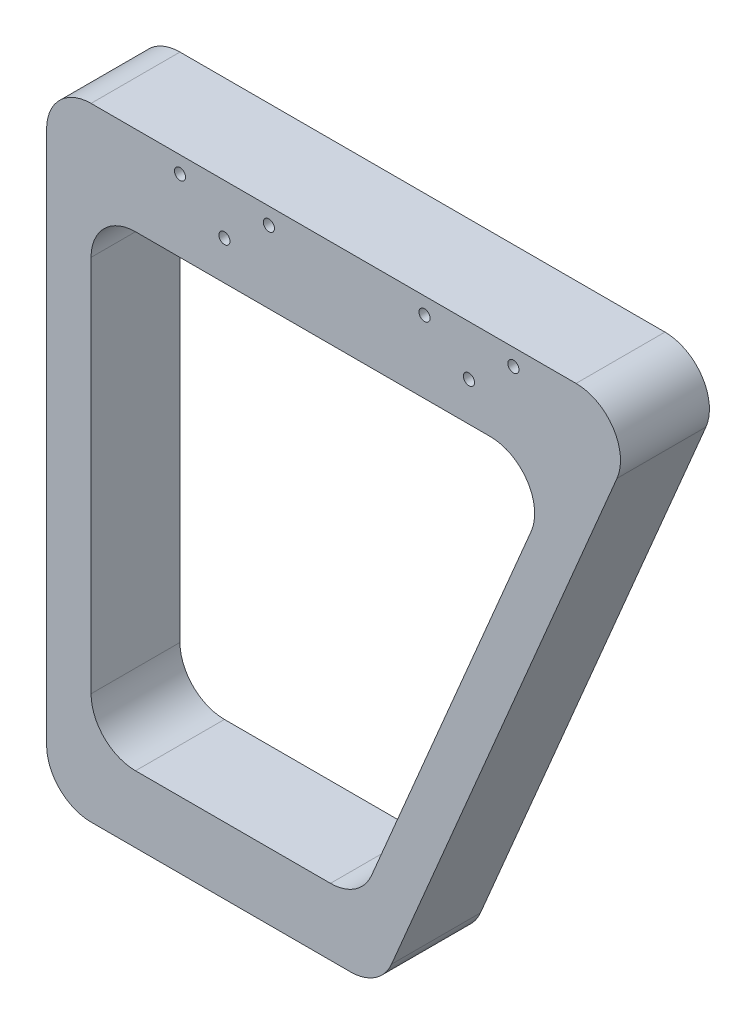
ISO-10303-21;
HEADER;
FILE_DESCRIPTION(('STEP AP214'),'2;1');
FILE_NAME('part.step','',(''),(''),'','','');
FILE_SCHEMA(('AUTOMOTIVE_DESIGN { 1 0 10303 214 1 1 1 1 }'));
ENDSEC;
DATA;
#1=APPLICATION_CONTEXT('core data for automotive mechanical design processes');
#2=APPLICATION_PROTOCOL_DEFINITION('international standard','automotive_design',2000,#1);
#3=PRODUCT_CONTEXT('',#1,'mechanical');
#4=PRODUCT('Part','Part','',(#3));
#5=PRODUCT_RELATED_PRODUCT_CATEGORY('part','',(#4));
#6=PRODUCT_DEFINITION_FORMATION('','',#4);
#7=PRODUCT_DEFINITION_CONTEXT('part definition',#1,'design');
#8=PRODUCT_DEFINITION('design','',#6,#7);
#9=PRODUCT_DEFINITION_SHAPE('','',#8);
#10=(LENGTH_UNIT() NAMED_UNIT(*) SI_UNIT(.MILLI.,.METRE.));
#11=(NAMED_UNIT(*) PLANE_ANGLE_UNIT() SI_UNIT($,.RADIAN.));
#12=(NAMED_UNIT(*) SI_UNIT($,.STERADIAN.) SOLID_ANGLE_UNIT());
#13=UNCERTAINTY_MEASURE_WITH_UNIT(LENGTH_MEASURE(1.E-05),#10,'distance_accuracy_value','');
#14=(GEOMETRIC_REPRESENTATION_CONTEXT(3) GLOBAL_UNCERTAINTY_ASSIGNED_CONTEXT((#13)) GLOBAL_UNIT_ASSIGNED_CONTEXT((#10,
#11,#12)) REPRESENTATION_CONTEXT('',''));
#15=CARTESIAN_POINT('',(0.,0.,0.));
#16=DIRECTION('',(0.,0.,1.));
#17=DIRECTION('',(1.,0.,0.));
#18=AXIS2_PLACEMENT_3D('',#15,#16,#17);
#19=CARTESIAN_POINT('',(-106.206306961118,44.8880670486545,40.));
#20=DIRECTION('',(0.921108392910916,-0.389306214321157,0.));
#21=DIRECTION('',(0.389306214321157,0.921108392910916,0.));
#22=AXIS2_PLACEMENT_3D('',#19,#20,#21);
#23=PLANE('',#22);
#24=DIRECTION('',(-0.389306214321157,-0.921108392910916,0.));
#25=VECTOR('',#24,1.);
#26=CARTESIAN_POINT('',(-106.206306961118,44.8880670486545,0.));
#27=LINE('',#26,#25);
#28=CARTESIAN_POINT('',(-92.6790897319771,76.893806654475,0.));
#29=VERTEX_POINT('',#28);
#30=CARTESIAN_POINT('',(-164.52954397162,-93.1061933455251,0.));
#31=VERTEX_POINT('',#30);
#32=EDGE_CURVE('E286',#29,#31,#27,.T.);
#33=ORIENTED_EDGE('',*,*,#32,.T.);
#34=DIRECTION('',(0.,0.,-1.));
#35=VECTOR('',#34,1.);
#36=CARTESIAN_POINT('',(-164.52954397162,-93.1061933455251,40.));
#37=LINE('',#36,#35);
#38=CARTESIAN_POINT('',(-164.52954397162,-93.1061933455251,40.));
#39=VERTEX_POINT('',#38);
#40=EDGE_CURVE('E263',#31,#39,#37,.F.);
#41=ORIENTED_EDGE('',*,*,#40,.T.);
#42=DIRECTION('',(-0.389306214321157,-0.921108392910916,0.));
#43=VECTOR('',#42,1.);
#44=CARTESIAN_POINT('',(-106.206306961118,44.8880670486545,40.));
#45=LINE('',#44,#43);
#46=CARTESIAN_POINT('',(-92.6790897319771,76.893806654475,40.));
#47=VERTEX_POINT('',#46);
#48=EDGE_CURVE('E298',#47,#39,#45,.T.);
#49=ORIENTED_EDGE('',*,*,#48,.F.);
#50=DIRECTION('',(0.,0.,-1.));
#51=VECTOR('',#50,1.);
#52=CARTESIAN_POINT('',(-92.6790897319771,76.893806654475,0.));
#53=LINE('',#52,#51);
#54=EDGE_CURVE('E259',#47,#29,#53,.T.);
#55=ORIENTED_EDGE('',*,*,#54,.T.);
#56=EDGE_LOOP('',(#33,#41,#49,#55));
#57=FACE_BOUND('',#56,.T.);
#58=ADVANCED_FACE('F45',(#57),#23,.F.);
#59=CARTESIAN_POINT('',(0.,-105.320069059102,40.));
#60=DIRECTION('',(0.,-1.,0.));
#61=DIRECTION('',(1.,0.,0.));
#62=AXIS2_PLACEMENT_3D('',#59,#60,#61);
#63=PLANE('',#62);
#64=DIRECTION('',(-1.,0.,0.));
#65=VECTOR('',#64,1.);
#66=CARTESIAN_POINT('',(0.,-105.320069059102,0.));
#67=LINE('',#66,#65);
#68=CARTESIAN_POINT('',(-182.951711829838,-105.320069059102,0.));
#69=VERTEX_POINT('',#68);
#70=CARTESIAN_POINT('',(-270.658255986875,-105.320069059102,0.));
#71=VERTEX_POINT('',#70);
#72=EDGE_CURVE('E329',#69,#71,#67,.T.);
#73=ORIENTED_EDGE('',*,*,#72,.T.);
#74=DIRECTION('',(0.,0.,-1.));
#75=VECTOR('',#74,1.);
#76=CARTESIAN_POINT('',(-270.658255986875,-105.320069059102,40.));
#77=LINE('',#76,#75);
#78=CARTESIAN_POINT('',(-270.658255986875,-105.320069059102,40.));
#79=VERTEX_POINT('',#78);
#80=EDGE_CURVE('E256',#71,#79,#77,.F.);
#81=ORIENTED_EDGE('',*,*,#80,.T.);
#82=DIRECTION('',(-1.,0.,0.));
#83=VECTOR('',#82,1.);
#84=CARTESIAN_POINT('',(0.,-105.320069059102,40.));
#85=LINE('',#84,#83);
#86=CARTESIAN_POINT('',(-182.951711829838,-105.320069059102,40.));
#87=VERTEX_POINT('',#86);
#88=EDGE_CURVE('E303',#87,#79,#85,.T.);
#89=ORIENTED_EDGE('',*,*,#88,.F.);
#90=DIRECTION('',(0.,0.,-1.));
#91=VECTOR('',#90,1.);
#92=CARTESIAN_POINT('',(-182.951711829838,-105.320069059102,0.));
#93=LINE('',#92,#91);
#94=EDGE_CURVE('E252',#87,#69,#93,.T.);
#95=ORIENTED_EDGE('',*,*,#94,.T.);
#96=EDGE_LOOP('',(#73,#81,#89,#95));
#97=FACE_BOUND('',#96,.T.);
#98=ADVANCED_FACE('F357',(#97),#63,.F.);
#99=CARTESIAN_POINT('',(-290.658255986875,0.,40.));
#100=DIRECTION('',(-1.,0.,0.));
#101=DIRECTION('',(0.,0.,1.));
#102=AXIS2_PLACEMENT_3D('',#99,#100,#101);
#103=PLANE('',#102);
#104=DIRECTION('',(0.,1.,0.));
#105=VECTOR('',#104,1.);
#106=CARTESIAN_POINT('',(-290.658255986875,0.,0.));
#107=LINE('',#106,#105);
#108=CARTESIAN_POINT('',(-290.658255986875,-85.320069059102,0.));
#109=VERTEX_POINT('',#108);
#110=CARTESIAN_POINT('',(-290.658255986875,84.6799309408981,0.));
#111=VERTEX_POINT('',#110);
#112=EDGE_CURVE('E293',#109,#111,#107,.T.);
#113=ORIENTED_EDGE('',*,*,#112,.T.);
#114=DIRECTION('',(0.,0.,-1.));
#115=VECTOR('',#114,1.);
#116=CARTESIAN_POINT('',(-290.658255986875,84.6799309408981,40.));
#117=LINE('',#116,#115);
#118=CARTESIAN_POINT('',(-290.658255986875,84.6799309408981,40.));
#119=VERTEX_POINT('',#118);
#120=EDGE_CURVE('E249',#111,#119,#117,.F.);
#121=ORIENTED_EDGE('',*,*,#120,.T.);
#122=DIRECTION('',(0.,1.,0.));
#123=VECTOR('',#122,1.);
#124=CARTESIAN_POINT('',(-290.658255986875,0.,40.));
#125=LINE('',#124,#123);
#126=CARTESIAN_POINT('',(-290.658255986875,-85.320069059102,40.));
#127=VERTEX_POINT('',#126);
#128=EDGE_CURVE('E196',#127,#119,#125,.T.);
#129=ORIENTED_EDGE('',*,*,#128,.F.);
#130=DIRECTION('',(0.,0.,-1.));
#131=VECTOR('',#130,1.);
#132=CARTESIAN_POINT('',(-290.658255986875,-85.320069059102,0.));
#133=LINE('',#132,#131);
#134=EDGE_CURVE('E245',#127,#109,#133,.T.);
#135=ORIENTED_EDGE('',*,*,#134,.T.);
#136=EDGE_LOOP('',(#113,#121,#129,#135));
#137=FACE_BOUND('',#136,.T.);
#138=ADVANCED_FACE('F337',(#137),#103,.F.);
#139=CARTESIAN_POINT('',(0.,144.679930940898,40.));
#140=DIRECTION('',(0.,1.,0.));
#141=DIRECTION('',(0.,0.,1.));
#142=AXIS2_PLACEMENT_3D('',#139,#140,#141);
#143=PLANE('',#142);
#144=DIRECTION('',(1.,0.,0.));
#145=VECTOR('',#144,1.);
#146=CARTESIAN_POINT('',(0.,144.679930940898,0.));
#147=LINE('',#146,#145);
#148=CARTESIAN_POINT('',(-290.658255986875,144.679930940898,0.));
#149=VERTEX_POINT('',#148);
#150=CARTESIAN_POINT('',(-72.4822971653211,144.679930940898,0.));
#151=VERTEX_POINT('',#150);
#152=EDGE_CURVE('E184',#149,#151,#147,.T.);
#153=ORIENTED_EDGE('',*,*,#152,.F.);
#154=DIRECTION('',(0.,0.,-1.));
#155=VECTOR('',#154,1.);
#156=CARTESIAN_POINT('',(-290.658255986875,144.679930940898,40.));
#157=LINE('',#156,#155);
#158=CARTESIAN_POINT('',(-290.658255986875,144.679930940898,40.));
#159=VERTEX_POINT('',#158);
#160=EDGE_CURVE('E212',#149,#159,#157,.F.);
#161=ORIENTED_EDGE('',*,*,#160,.T.);
#162=DIRECTION('',(1.,0.,0.));
#163=VECTOR('',#162,1.);
#164=CARTESIAN_POINT('',(0.,144.679930940898,40.));
#165=LINE('',#164,#163);
#166=CARTESIAN_POINT('',(-72.4822971653211,144.679930940898,40.));
#167=VERTEX_POINT('',#166);
#168=EDGE_CURVE('E292',#159,#167,#165,.T.);
#169=ORIENTED_EDGE('',*,*,#168,.T.);
#170=DIRECTION('',(0.,0.,-1.));
#171=VECTOR('',#170,1.);
#172=CARTESIAN_POINT('',(-72.4822971653211,144.679930940898,0.));
#173=LINE('',#172,#171);
#174=EDGE_CURVE('E208',#167,#151,#173,.T.);
#175=ORIENTED_EDGE('',*,*,#174,.T.);
#176=EDGE_LOOP('',(#153,#161,#169,#175));
#177=FACE_BOUND('',#176,.T.);
#178=ADVANCED_FACE('F376',(#177),#143,.T.);
#179=CARTESIAN_POINT('',(-310.658255986875,0.,40.));
#180=DIRECTION('',(-1.,0.,0.));
#181=DIRECTION('',(0.,0.,1.));
#182=AXIS2_PLACEMENT_3D('',#179,#180,#181);
#183=PLANE('',#182);
#184=DIRECTION('',(0.,1.,0.));
#185=VECTOR('',#184,1.);
#186=CARTESIAN_POINT('',(-310.658255986875,0.,40.));
#187=LINE('',#186,#185);
#188=CARTESIAN_POINT('',(-310.658255986875,-115.320069059102,40.));
#189=VERTEX_POINT('',#188);
#190=CARTESIAN_POINT('',(-310.658255986875,124.679930940898,40.));
#191=VERTEX_POINT('',#190);
#192=EDGE_CURVE('E407',#189,#191,#187,.T.);
#193=ORIENTED_EDGE('',*,*,#192,.T.);
#194=DIRECTION('',(0.,0.,-1.));
#195=VECTOR('',#194,1.);
#196=CARTESIAN_POINT('',(-310.658255986875,124.679930940898,40.));
#197=LINE('',#196,#195);
#198=CARTESIAN_POINT('',(-310.658255986875,124.679930940898,0.));
#199=VERTEX_POINT('',#198);
#200=EDGE_CURVE('E182',#191,#199,#197,.T.);
#201=ORIENTED_EDGE('',*,*,#200,.T.);
#202=DIRECTION('',(0.,1.,0.));
#203=VECTOR('',#202,1.);
#204=CARTESIAN_POINT('',(-310.658255986875,0.,0.));
#205=LINE('',#204,#203);
#206=CARTESIAN_POINT('',(-310.658255986875,-115.320069059102,0.));
#207=VERTEX_POINT('',#206);
#208=EDGE_CURVE('E164',#207,#199,#205,.T.);
#209=ORIENTED_EDGE('',*,*,#208,.F.);
#210=DIRECTION('',(0.,0.,-1.));
#211=VECTOR('',#210,1.);
#212=CARTESIAN_POINT('',(-310.658255986875,-115.320069059102,40.));
#213=LINE('',#212,#211);
#214=EDGE_CURVE('E179',#207,#189,#213,.F.);
#215=ORIENTED_EDGE('',*,*,#214,.T.);
#216=EDGE_LOOP('',(#193,#201,#209,#215));
#217=FACE_BOUND('',#216,.T.);
#218=ADVANCED_FACE('F178',(#217),#183,.T.);
#219=CARTESIAN_POINT('',(0.,-135.320069059102,40.));
#220=DIRECTION('',(0.,1.,0.));
#221=DIRECTION('',(0.,0.,1.));
#222=AXIS2_PLACEMENT_3D('',#219,#220,#221);
#223=PLANE('',#222);
#224=DIRECTION('',(1.,0.,0.));
#225=VECTOR('',#224,1.);
#226=CARTESIAN_POINT('',(0.,-135.320069059102,40.));
#227=LINE('',#226,#225);
#228=CARTESIAN_POINT('',(-290.658255986875,-135.320069059102,40.));
#229=VERTEX_POINT('',#228);
#230=CARTESIAN_POINT('',(-173.918232562464,-135.320069059102,40.));
#231=VERTEX_POINT('',#230);
#232=EDGE_CURVE('E311',#229,#231,#227,.T.);
#233=ORIENTED_EDGE('',*,*,#232,.F.);
#234=DIRECTION('',(0.,0.,-1.));
#235=VECTOR('',#234,1.);
#236=CARTESIAN_POINT('',(-290.658255986875,-135.320069059102,0.));
#237=LINE('',#236,#235);
#238=CARTESIAN_POINT('',(-290.658255986875,-135.320069059102,0.));
#239=VERTEX_POINT('',#238);
#240=EDGE_CURVE('E229',#229,#239,#237,.T.);
#241=ORIENTED_EDGE('',*,*,#240,.T.);
#242=DIRECTION('',(1.,0.,0.));
#243=VECTOR('',#242,1.);
#244=CARTESIAN_POINT('',(0.,-135.320069059102,0.));
#245=LINE('',#244,#243);
#246=CARTESIAN_POINT('',(-173.918232562464,-135.320069059102,0.));
#247=VERTEX_POINT('',#246);
#248=EDGE_CURVE('E166',#239,#247,#245,.T.);
#249=ORIENTED_EDGE('',*,*,#248,.T.);
#250=DIRECTION('',(0.,0.,-1.));
#251=VECTOR('',#250,1.);
#252=CARTESIAN_POINT('',(-173.918232562464,-135.320069059102,40.));
#253=LINE('',#252,#251);
#254=EDGE_CURVE('E226',#247,#231,#253,.F.);
#255=ORIENTED_EDGE('',*,*,#254,.T.);
#256=EDGE_LOOP('',(#233,#241,#249,#255));
#257=FACE_BOUND('',#256,.T.);
#258=ADVANCED_FACE('F369',(#257),#223,.F.);
#259=CARTESIAN_POINT('',(-87.7841391028996,37.1019427622313,40.));
#260=DIRECTION('',(-0.921108392910916,0.389306214321157,0.));
#261=DIRECTION('',(-0.389306214321157,-0.921108392910916,0.));
#262=AXIS2_PLACEMENT_3D('',#259,#260,#261);
#263=PLANE('',#262);
#264=DIRECTION('',(0.389306214321157,0.921108392910916,0.));
#265=VECTOR('',#264,1.);
#266=CARTESIAN_POINT('',(-87.7841391028996,37.1019427622313,40.));
#267=LINE('',#266,#265);
#268=CARTESIAN_POINT('',(-155.496064704246,-123.106193345525,40.));
#269=VERTEX_POINT('',#268);
#270=CARTESIAN_POINT('',(-54.0601293071027,116.893806654475,40.));
#271=VERTEX_POINT('',#270);
#272=EDGE_CURVE('E304',#269,#271,#267,.T.);
#273=ORIENTED_EDGE('',*,*,#272,.F.);
#274=DIRECTION('',(0.,0.,-1.));
#275=VECTOR('',#274,1.);
#276=CARTESIAN_POINT('',(-155.496064704246,-123.106193345525,40.));
#277=LINE('',#276,#275);
#278=CARTESIAN_POINT('',(-155.496064704246,-123.106193345525,0.));
#279=VERTEX_POINT('',#278);
#280=EDGE_CURVE('E235',#269,#279,#277,.T.);
#281=ORIENTED_EDGE('',*,*,#280,.T.);
#282=DIRECTION('',(0.389306214321157,0.921108392910916,0.));
#283=VECTOR('',#282,1.);
#284=CARTESIAN_POINT('',(-87.7841391028996,37.1019427622313,0.));
#285=LINE('',#284,#283);
#286=CARTESIAN_POINT('',(-54.0601293071027,116.893806654475,0.));
#287=VERTEX_POINT('',#286);
#288=EDGE_CURVE('E323',#279,#287,#285,.T.);
#289=ORIENTED_EDGE('',*,*,#288,.T.);
#290=DIRECTION('',(0.,0.,-1.));
#291=VECTOR('',#290,1.);
#292=CARTESIAN_POINT('',(-54.0601293071028,116.893806654475,40.));
#293=LINE('',#292,#291);
#294=EDGE_CURVE('E232',#287,#271,#293,.F.);
#295=ORIENTED_EDGE('',*,*,#294,.T.);
#296=EDGE_LOOP('',(#273,#281,#289,#295));
#297=FACE_BOUND('',#296,.T.);
#298=ADVANCED_FACE('F366',(#297),#263,.F.);
#299=CARTESIAN_POINT('',(0.,104.679930940898,40.));
#300=DIRECTION('',(0.,1.,0.));
#301=DIRECTION('',(-1.,0.,0.));
#302=AXIS2_PLACEMENT_3D('',#299,#300,#301);
#303=PLANE('',#302);
#304=DIRECTION('',(1.,0.,0.));
#305=VECTOR('',#304,1.);
#306=CARTESIAN_POINT('',(0.,104.679930940898,40.));
#307=LINE('',#306,#305);
#308=CARTESIAN_POINT('',(-270.658255986875,104.679930940898,40.));
#309=VERTEX_POINT('',#308);
#310=CARTESIAN_POINT('',(-111.101257590195,104.679930940898,40.));
#311=VERTEX_POINT('',#310);
#312=EDGE_CURVE('E190',#309,#311,#307,.T.);
#313=ORIENTED_EDGE('',*,*,#312,.F.);
#314=DIRECTION('',(0.,0.,-1.));
#315=VECTOR('',#314,1.);
#316=CARTESIAN_POINT('',(-270.658255986875,104.679930940898,0.));
#317=LINE('',#316,#315);
#318=CARTESIAN_POINT('',(-270.658255986875,104.679930940898,0.));
#319=VERTEX_POINT('',#318);
#320=EDGE_CURVE('E241',#309,#319,#317,.T.);
#321=ORIENTED_EDGE('',*,*,#320,.T.);
#322=DIRECTION('',(1.,0.,0.));
#323=VECTOR('',#322,1.);
#324=CARTESIAN_POINT('',(0.,104.679930940898,0.));
#325=LINE('',#324,#323);
#326=CARTESIAN_POINT('',(-111.101257590195,104.679930940898,0.));
#327=VERTEX_POINT('',#326);
#328=EDGE_CURVE('E199',#319,#327,#325,.T.);
#329=ORIENTED_EDGE('',*,*,#328,.T.);
#330=DIRECTION('',(0.,0.,-1.));
#331=VECTOR('',#330,1.);
#332=CARTESIAN_POINT('',(-111.101257590195,104.679930940898,40.));
#333=LINE('',#332,#331);
#334=EDGE_CURVE('E61',#327,#311,#333,.F.);
#335=ORIENTED_EDGE('',*,*,#334,.T.);
#336=EDGE_LOOP('',(#313,#321,#329,#335));
#337=FACE_BOUND('',#336,.T.);
#338=ADVANCED_FACE('F289',(#337),#303,.F.);
#339=CARTESIAN_POINT('',(0.,0.,40.));
#340=DIRECTION('',(0.,0.,1.));
#341=DIRECTION('',(1.,0.,0.));
#342=AXIS2_PLACEMENT_3D('',#339,#340,#341);
#343=PLANE('',#342);
#344=CARTESIAN_POINT('',(-140.658255986875,137.179930940898,40.));
#345=DIRECTION('',(0.,0.,-1.));
#346=DIRECTION('',(-1.,0.,0.));
#347=AXIS2_PLACEMENT_3D('',#344,#345,#346);
#348=CIRCLE('',#347,2.5);
#349=CARTESIAN_POINT('',(-143.158255986875,137.179930940898,40.));
#350=VERTEX_POINT('',#349);
#351=EDGE_CURVE('E453',#350,#350,#348,.T.);
#352=ORIENTED_EDGE('',*,*,#351,.T.);
#353=EDGE_LOOP('',(#352));
#354=FACE_BOUND('',#353,.T.);
#355=CARTESIAN_POINT('',(-100.658255986875,137.179930940898,40.));
#356=DIRECTION('',(0.,0.,-1.));
#357=DIRECTION('',(-1.,0.,0.));
#358=AXIS2_PLACEMENT_3D('',#355,#356,#357);
#359=CIRCLE('',#358,2.5);
#360=CARTESIAN_POINT('',(-103.158255986875,137.179930940898,40.));
#361=VERTEX_POINT('',#360);
#362=EDGE_CURVE('E445',#361,#361,#359,.T.);
#363=ORIENTED_EDGE('',*,*,#362,.T.);
#364=EDGE_LOOP('',(#363));
#365=FACE_BOUND('',#364,.T.);
#366=CARTESIAN_POINT('',(-120.658255986875,122.179930940898,40.));
#367=DIRECTION('',(0.,0.,-1.));
#368=DIRECTION('',(-1.,0.,0.));
#369=AXIS2_PLACEMENT_3D('',#366,#367,#368);
#370=CIRCLE('',#369,2.5);
#371=CARTESIAN_POINT('',(-123.158255986875,122.179930940898,40.));
#372=VERTEX_POINT('',#371);
#373=EDGE_CURVE('E437',#372,#372,#370,.T.);
#374=ORIENTED_EDGE('',*,*,#373,.T.);
#375=EDGE_LOOP('',(#374));
#376=FACE_BOUND('',#375,.T.);
#377=CARTESIAN_POINT('',(-210.658255986875,137.179930940898,40.));
#378=DIRECTION('',(0.,0.,1.));
#379=DIRECTION('',(1.,0.,0.));
#380=AXIS2_PLACEMENT_3D('',#377,#378,#379);
#381=CIRCLE('',#380,2.5);
#382=CARTESIAN_POINT('',(-208.158255986875,137.179930940898,40.));
#383=VERTEX_POINT('',#382);
#384=EDGE_CURVE('E430',#383,#383,#381,.T.);
#385=ORIENTED_EDGE('',*,*,#384,.F.);
#386=EDGE_LOOP('',(#385));
#387=FACE_BOUND('',#386,.T.);
#388=CARTESIAN_POINT('',(-250.658255986875,137.179930940898,40.));
#389=DIRECTION('',(0.,0.,1.));
#390=DIRECTION('',(1.,0.,0.));
#391=AXIS2_PLACEMENT_3D('',#388,#389,#390);
#392=CIRCLE('',#391,2.5);
#393=CARTESIAN_POINT('',(-248.158255986875,137.179930940898,40.));
#394=VERTEX_POINT('',#393);
#395=EDGE_CURVE('E426',#394,#394,#392,.T.);
#396=ORIENTED_EDGE('',*,*,#395,.F.);
#397=EDGE_LOOP('',(#396));
#398=FACE_BOUND('',#397,.T.);
#399=CARTESIAN_POINT('',(-230.658255986875,122.179930940898,40.));
#400=DIRECTION('',(0.,0.,1.));
#401=DIRECTION('',(1.,0.,0.));
#402=AXIS2_PLACEMENT_3D('',#399,#400,#401);
#403=CIRCLE('',#402,2.5);
#404=CARTESIAN_POINT('',(-228.158255986875,122.179930940898,40.));
#405=VERTEX_POINT('',#404);
#406=EDGE_CURVE('E417',#405,#405,#403,.T.);
#407=ORIENTED_EDGE('',*,*,#406,.F.);
#408=EDGE_LOOP('',(#407));
#409=FACE_BOUND('',#408,.T.);
#410=ORIENTED_EDGE('',*,*,#168,.F.);
#411=CARTESIAN_POINT('',(-290.658255986875,124.679930940898,40.));
#412=DIRECTION('',(0.,0.,1.));
#413=DIRECTION('',(1.,0.,0.));
#414=AXIS2_PLACEMENT_3D('',#411,#412,#413);
#415=CIRCLE('',#414,20.);
#416=EDGE_CURVE('E223',#159,#191,#415,.T.);
#417=ORIENTED_EDGE('',*,*,#416,.T.);
#418=ORIENTED_EDGE('',*,*,#192,.F.);
#419=CARTESIAN_POINT('',(-290.658255986875,-115.320069059102,40.));
#420=DIRECTION('',(0.,0.,1.));
#421=DIRECTION('',(1.,0.,0.));
#422=AXIS2_PLACEMENT_3D('',#419,#420,#421);
#423=CIRCLE('',#422,20.);
#424=EDGE_CURVE('E188',#189,#229,#423,.T.);
#425=ORIENTED_EDGE('',*,*,#424,.T.);
#426=ORIENTED_EDGE('',*,*,#232,.T.);
#427=CARTESIAN_POINT('',(-173.918232562464,-115.320069059102,40.));
#428=DIRECTION('',(0.,0.,1.));
#429=DIRECTION('',(1.,0.,0.));
#430=AXIS2_PLACEMENT_3D('',#427,#428,#429);
#431=CIRCLE('',#430,20.);
#432=EDGE_CURVE('E218',#231,#269,#431,.T.);
#433=ORIENTED_EDGE('',*,*,#432,.T.);
#434=ORIENTED_EDGE('',*,*,#272,.T.);
#435=CARTESIAN_POINT('',(-72.4822971653211,124.679930940898,40.));
#436=DIRECTION('',(0.,0.,1.));
#437=DIRECTION('',(1.,0.,0.));
#438=AXIS2_PLACEMENT_3D('',#435,#436,#437);
#439=CIRCLE('',#438,20.);
#440=EDGE_CURVE('E215',#271,#167,#439,.T.);
#441=ORIENTED_EDGE('',*,*,#440,.T.);
#442=EDGE_LOOP('',(#410,#417,#418,#425,#426,#433,#434,#441));
#443=FACE_BOUND('',#442,.T.);
#444=ORIENTED_EDGE('',*,*,#312,.T.);
#445=CARTESIAN_POINT('',(-111.101257590195,84.6799309408981,40.));
#446=DIRECTION('',(0.,0.,1.));
#447=DIRECTION('',(1.,0.,0.));
#448=AXIS2_PLACEMENT_3D('',#445,#446,#447);
#449=CIRCLE('',#448,20.);
#450=EDGE_CURVE('E11',#311,#47,#449,.F.);
#451=ORIENTED_EDGE('',*,*,#450,.T.);
#452=ORIENTED_EDGE('',*,*,#48,.T.);
#453=CARTESIAN_POINT('',(-182.951711829838,-85.3200690591019,40.));
#454=DIRECTION('',(0.,0.,1.));
#455=DIRECTION('',(1.,0.,0.));
#456=AXIS2_PLACEMENT_3D('',#453,#454,#455);
#457=CIRCLE('',#456,20.);
#458=EDGE_CURVE('E280',#39,#87,#457,.F.);
#459=ORIENTED_EDGE('',*,*,#458,.T.);
#460=ORIENTED_EDGE('',*,*,#88,.T.);
#461=CARTESIAN_POINT('',(-270.658255986875,-85.320069059102,40.));
#462=DIRECTION('',(0.,0.,1.));
#463=DIRECTION('',(1.,0.,0.));
#464=AXIS2_PLACEMENT_3D('',#461,#462,#463);
#465=CIRCLE('',#464,20.);
#466=EDGE_CURVE('E274',#79,#127,#465,.F.);
#467=ORIENTED_EDGE('',*,*,#466,.T.);
#468=ORIENTED_EDGE('',*,*,#128,.T.);
#469=CARTESIAN_POINT('',(-270.658255986875,84.6799309408981,40.));
#470=DIRECTION('',(0.,0.,1.));
#471=DIRECTION('',(1.,0.,0.));
#472=AXIS2_PLACEMENT_3D('',#469,#470,#471);
#473=CIRCLE('',#472,20.);
#474=EDGE_CURVE('E68',#119,#309,#473,.F.);
#475=ORIENTED_EDGE('',*,*,#474,.T.);
#476=EDGE_LOOP('',(#444,#451,#452,#459,#460,#467,#468,#475));
#477=FACE_BOUND('',#476,.T.);
#478=ADVANCED_FACE('F297',(#354,#365,#376,#387,#398,#409,#443,#477),#343,.T.);
#479=CARTESIAN_POINT('',(0.,0.,0.));
#480=DIRECTION('',(0.,0.,1.));
#481=DIRECTION('',(1.,0.,0.));
#482=AXIS2_PLACEMENT_3D('',#479,#480,#481);
#483=PLANE('',#482);
#484=ORIENTED_EDGE('',*,*,#208,.T.);
#485=CARTESIAN_POINT('',(-290.658255986875,124.679930940898,0.));
#486=DIRECTION('',(0.,0.,1.));
#487=DIRECTION('',(1.,0.,0.));
#488=AXIS2_PLACEMENT_3D('',#485,#486,#487);
#489=CIRCLE('',#488,20.);
#490=EDGE_CURVE('E172',#199,#149,#489,.F.);
#491=ORIENTED_EDGE('',*,*,#490,.T.);
#492=ORIENTED_EDGE('',*,*,#152,.T.);
#493=CARTESIAN_POINT('',(-72.4822971653211,124.679930940898,0.));
#494=DIRECTION('',(0.,0.,1.));
#495=DIRECTION('',(1.,0.,0.));
#496=AXIS2_PLACEMENT_3D('',#493,#494,#495);
#497=CIRCLE('',#496,20.);
#498=EDGE_CURVE('E194',#151,#287,#497,.F.);
#499=ORIENTED_EDGE('',*,*,#498,.T.);
#500=ORIENTED_EDGE('',*,*,#288,.F.);
#501=CARTESIAN_POINT('',(-173.918232562464,-115.320069059102,0.));
#502=DIRECTION('',(0.,0.,1.));
#503=DIRECTION('',(1.,0.,0.));
#504=AXIS2_PLACEMENT_3D('',#501,#502,#503);
#505=CIRCLE('',#504,20.);
#506=EDGE_CURVE('E173',#279,#247,#505,.F.);
#507=ORIENTED_EDGE('',*,*,#506,.T.);
#508=ORIENTED_EDGE('',*,*,#248,.F.);
#509=CARTESIAN_POINT('',(-290.658255986875,-115.320069059102,0.));
#510=DIRECTION('',(0.,0.,1.));
#511=DIRECTION('',(1.,0.,0.));
#512=AXIS2_PLACEMENT_3D('',#509,#510,#511);
#513=CIRCLE('',#512,20.);
#514=EDGE_CURVE('E160',#239,#207,#513,.F.);
#515=ORIENTED_EDGE('',*,*,#514,.T.);
#516=EDGE_LOOP('',(#484,#491,#492,#499,#500,#507,#508,#515));
#517=FACE_BOUND('',#516,.T.);
#518=ORIENTED_EDGE('',*,*,#32,.F.);
#519=CARTESIAN_POINT('',(-111.101257590195,84.6799309408981,0.));
#520=DIRECTION('',(0.,0.,1.));
#521=DIRECTION('',(1.,0.,0.));
#522=AXIS2_PLACEMENT_3D('',#519,#520,#521);
#523=CIRCLE('',#522,20.);
#524=EDGE_CURVE('E54',#29,#327,#523,.T.);
#525=ORIENTED_EDGE('',*,*,#524,.T.);
#526=ORIENTED_EDGE('',*,*,#328,.F.);
#527=CARTESIAN_POINT('',(-270.658255986875,84.6799309408981,0.));
#528=DIRECTION('',(0.,0.,1.));
#529=DIRECTION('',(1.,0.,0.));
#530=AXIS2_PLACEMENT_3D('',#527,#528,#529);
#531=CIRCLE('',#530,20.);
#532=EDGE_CURVE('E266',#319,#111,#531,.T.);
#533=ORIENTED_EDGE('',*,*,#532,.T.);
#534=ORIENTED_EDGE('',*,*,#112,.F.);
#535=CARTESIAN_POINT('',(-270.658255986875,-85.320069059102,0.));
#536=DIRECTION('',(0.,0.,1.));
#537=DIRECTION('',(1.,0.,0.));
#538=AXIS2_PLACEMENT_3D('',#535,#536,#537);
#539=CIRCLE('',#538,20.);
#540=EDGE_CURVE('E271',#109,#71,#539,.T.);
#541=ORIENTED_EDGE('',*,*,#540,.T.);
#542=ORIENTED_EDGE('',*,*,#72,.F.);
#543=CARTESIAN_POINT('',(-182.951711829838,-85.3200690591019,0.));
#544=DIRECTION('',(0.,0.,1.));
#545=DIRECTION('',(1.,0.,0.));
#546=AXIS2_PLACEMENT_3D('',#543,#544,#545);
#547=CIRCLE('',#546,20.);
#548=EDGE_CURVE('E277',#69,#31,#547,.T.);
#549=ORIENTED_EDGE('',*,*,#548,.T.);
#550=EDGE_LOOP('',(#518,#525,#526,#533,#534,#541,#542,#549));
#551=FACE_BOUND('',#550,.T.);
#552=ADVANCED_FACE('F162',(#517,#551),#483,.F.);
#553=CARTESIAN_POINT('',(-290.658255986875,124.679930940898,40.));
#554=DIRECTION('',(0.,0.,-1.));
#555=DIRECTION('',(-1.,0.,0.));
#556=AXIS2_PLACEMENT_3D('',#553,#554,#555);
#557=CYLINDRICAL_SURFACE('',#556,20.);
#558=ORIENTED_EDGE('',*,*,#416,.F.);
#559=ORIENTED_EDGE('',*,*,#160,.F.);
#560=ORIENTED_EDGE('',*,*,#490,.F.);
#561=ORIENTED_EDGE('',*,*,#200,.F.);
#562=EDGE_LOOP('',(#558,#559,#560,#561));
#563=FACE_BOUND('',#562,.T.);
#564=ADVANCED_FACE('F380',(#563),#557,.T.);
#565=CARTESIAN_POINT('',(-290.658255986875,-115.320069059102,40.));
#566=DIRECTION('',(0.,0.,1.));
#567=DIRECTION('',(1.,0.,0.));
#568=AXIS2_PLACEMENT_3D('',#565,#566,#567);
#569=CYLINDRICAL_SURFACE('',#568,20.);
#570=ORIENTED_EDGE('',*,*,#424,.F.);
#571=ORIENTED_EDGE('',*,*,#214,.F.);
#572=ORIENTED_EDGE('',*,*,#514,.F.);
#573=ORIENTED_EDGE('',*,*,#240,.F.);
#574=EDGE_LOOP('',(#570,#571,#572,#573));
#575=FACE_BOUND('',#574,.T.);
#576=ADVANCED_FACE('F187',(#575),#569,.T.);
#577=CARTESIAN_POINT('',(-173.918232562464,-115.320069059102,40.));
#578=DIRECTION('',(0.,0.,-1.));
#579=DIRECTION('',(-1.,0.,0.));
#580=AXIS2_PLACEMENT_3D('',#577,#578,#579);
#581=CYLINDRICAL_SURFACE('',#580,20.);
#582=ORIENTED_EDGE('',*,*,#432,.F.);
#583=ORIENTED_EDGE('',*,*,#254,.F.);
#584=ORIENTED_EDGE('',*,*,#506,.F.);
#585=ORIENTED_EDGE('',*,*,#280,.F.);
#586=EDGE_LOOP('',(#582,#583,#584,#585));
#587=FACE_BOUND('',#586,.T.);
#588=ADVANCED_FACE('F353',(#587),#581,.T.);
#589=CARTESIAN_POINT('',(-72.4822971653211,124.679930940898,40.));
#590=DIRECTION('',(0.,0.,1.));
#591=DIRECTION('',(1.,0.,0.));
#592=AXIS2_PLACEMENT_3D('',#589,#590,#591);
#593=CYLINDRICAL_SURFACE('',#592,20.);
#594=ORIENTED_EDGE('',*,*,#440,.F.);
#595=ORIENTED_EDGE('',*,*,#294,.F.);
#596=ORIENTED_EDGE('',*,*,#498,.F.);
#597=ORIENTED_EDGE('',*,*,#174,.F.);
#598=EDGE_LOOP('',(#594,#595,#596,#597));
#599=FACE_BOUND('',#598,.T.);
#600=ADVANCED_FACE('F344',(#599),#593,.T.);
#601=CARTESIAN_POINT('',(-270.658255986875,84.6799309408981,40.));
#602=DIRECTION('',(0.,0.,1.));
#603=DIRECTION('',(1.,0.,0.));
#604=AXIS2_PLACEMENT_3D('',#601,#602,#603);
#605=CYLINDRICAL_SURFACE('',#604,20.);
#606=ORIENTED_EDGE('',*,*,#474,.F.);
#607=ORIENTED_EDGE('',*,*,#120,.F.);
#608=ORIENTED_EDGE('',*,*,#532,.F.);
#609=ORIENTED_EDGE('',*,*,#320,.F.);
#610=EDGE_LOOP('',(#606,#607,#608,#609));
#611=FACE_BOUND('',#610,.T.);
#612=ADVANCED_FACE('F341',(#611),#605,.F.);
#613=CARTESIAN_POINT('',(-270.658255986875,-85.320069059102,40.));
#614=DIRECTION('',(0.,0.,1.));
#615=DIRECTION('',(1.,0.,0.));
#616=AXIS2_PLACEMENT_3D('',#613,#614,#615);
#617=CYLINDRICAL_SURFACE('',#616,20.);
#618=ORIENTED_EDGE('',*,*,#466,.F.);
#619=ORIENTED_EDGE('',*,*,#80,.F.);
#620=ORIENTED_EDGE('',*,*,#540,.F.);
#621=ORIENTED_EDGE('',*,*,#134,.F.);
#622=EDGE_LOOP('',(#618,#619,#620,#621));
#623=FACE_BOUND('',#622,.T.);
#624=ADVANCED_FACE('F343',(#623),#617,.F.);
#625=CARTESIAN_POINT('',(-182.951711829838,-85.3200690591019,40.));
#626=DIRECTION('',(0.,0.,1.));
#627=DIRECTION('',(1.,0.,0.));
#628=AXIS2_PLACEMENT_3D('',#625,#626,#627);
#629=CYLINDRICAL_SURFACE('',#628,20.);
#630=ORIENTED_EDGE('',*,*,#458,.F.);
#631=ORIENTED_EDGE('',*,*,#40,.F.);
#632=ORIENTED_EDGE('',*,*,#548,.F.);
#633=ORIENTED_EDGE('',*,*,#94,.F.);
#634=EDGE_LOOP('',(#630,#631,#632,#633));
#635=FACE_BOUND('',#634,.T.);
#636=ADVANCED_FACE('F350',(#635),#629,.F.);
#637=CARTESIAN_POINT('',(-111.101257590195,84.6799309408981,40.));
#638=DIRECTION('',(0.,0.,1.));
#639=DIRECTION('',(1.,0.,0.));
#640=AXIS2_PLACEMENT_3D('',#637,#638,#639);
#641=CYLINDRICAL_SURFACE('',#640,20.);
#642=ORIENTED_EDGE('',*,*,#450,.F.);
#643=ORIENTED_EDGE('',*,*,#334,.F.);
#644=ORIENTED_EDGE('',*,*,#524,.F.);
#645=ORIENTED_EDGE('',*,*,#54,.F.);
#646=EDGE_LOOP('',(#642,#643,#644,#645));
#647=FACE_BOUND('',#646,.T.);
#648=ADVANCED_FACE('F47',(#647),#641,.F.);
#649=CARTESIAN_POINT('',(-230.658255986875,122.179930940898,30.));
#650=DIRECTION('',(0.,0.,1.));
#651=DIRECTION('',(1.,0.,0.));
#652=AXIS2_PLACEMENT_3D('',#649,#650,#651);
#653=CYLINDRICAL_SURFACE('',#652,2.5);
#654=CARTESIAN_POINT('',(-230.658255986875,122.179930940898,30.));
#655=DIRECTION('',(0.,0.,1.));
#656=DIRECTION('',(1.,0.,0.));
#657=AXIS2_PLACEMENT_3D('',#654,#655,#656);
#658=CIRCLE('',#657,2.5);
#659=CARTESIAN_POINT('',(-228.158255986875,122.179930940898,30.));
#660=VERTEX_POINT('',#659);
#661=EDGE_CURVE('E412',#660,#660,#658,.T.);
#662=ORIENTED_EDGE('',*,*,#661,.F.);
#663=EDGE_LOOP('',(#662));
#664=FACE_BOUND('',#663,.T.);
#665=ORIENTED_EDGE('',*,*,#406,.T.);
#666=EDGE_LOOP('',(#665));
#667=FACE_BOUND('',#666,.T.);
#668=ADVANCED_FACE('F505',(#664,#667),#653,.F.);
#669=CARTESIAN_POINT('',(-230.658255986875,122.179930940898,30.));
#670=DIRECTION('',(0.,0.,1.));
#671=DIRECTION('',(1.,0.,0.));
#672=AXIS2_PLACEMENT_3D('',#669,#670,#671);
#673=PLANE('',#672);
#674=ORIENTED_EDGE('',*,*,#661,.T.);
#675=EDGE_LOOP('',(#674));
#676=FACE_BOUND('',#675,.T.);
#677=ADVANCED_FACE('F500',(#676),#673,.T.);
#678=CARTESIAN_POINT('',(-250.658255986875,137.179930940898,30.));
#679=DIRECTION('',(0.,0.,1.));
#680=DIRECTION('',(1.,0.,0.));
#681=AXIS2_PLACEMENT_3D('',#678,#679,#680);
#682=CYLINDRICAL_SURFACE('',#681,2.5);
#683=CARTESIAN_POINT('',(-250.658255986875,137.179930940898,30.));
#684=DIRECTION('',(0.,0.,1.));
#685=DIRECTION('',(1.,0.,0.));
#686=AXIS2_PLACEMENT_3D('',#683,#684,#685);
#687=CIRCLE('',#686,2.5);
#688=CARTESIAN_POINT('',(-248.158255986875,137.179930940898,30.));
#689=VERTEX_POINT('',#688);
#690=EDGE_CURVE('E422',#689,#689,#687,.T.);
#691=ORIENTED_EDGE('',*,*,#690,.F.);
#692=EDGE_LOOP('',(#691));
#693=FACE_BOUND('',#692,.T.);
#694=ORIENTED_EDGE('',*,*,#395,.T.);
#695=EDGE_LOOP('',(#694));
#696=FACE_BOUND('',#695,.T.);
#697=ADVANCED_FACE('F497',(#693,#696),#682,.F.);
#698=CARTESIAN_POINT('',(-250.658255986875,137.179930940898,30.));
#699=DIRECTION('',(0.,0.,1.));
#700=DIRECTION('',(1.,0.,0.));
#701=AXIS2_PLACEMENT_3D('',#698,#699,#700);
#702=PLANE('',#701);
#703=ORIENTED_EDGE('',*,*,#690,.T.);
#704=EDGE_LOOP('',(#703));
#705=FACE_BOUND('',#704,.T.);
#706=ADVANCED_FACE('F495',(#705),#702,.T.);
#707=CARTESIAN_POINT('',(-210.658255986875,137.179930940898,30.));
#708=DIRECTION('',(0.,0.,1.));
#709=DIRECTION('',(1.,0.,0.));
#710=AXIS2_PLACEMENT_3D('',#707,#708,#709);
#711=CYLINDRICAL_SURFACE('',#710,2.5);
#712=CARTESIAN_POINT('',(-210.658255986875,137.179930940898,30.));
#713=DIRECTION('',(0.,0.,1.));
#714=DIRECTION('',(1.,0.,0.));
#715=AXIS2_PLACEMENT_3D('',#712,#713,#714);
#716=CIRCLE('',#715,2.5);
#717=CARTESIAN_POINT('',(-208.158255986875,137.179930940898,30.));
#718=VERTEX_POINT('',#717);
#719=EDGE_CURVE('E319',#718,#718,#716,.T.);
#720=ORIENTED_EDGE('',*,*,#719,.F.);
#721=EDGE_LOOP('',(#720));
#722=FACE_BOUND('',#721,.T.);
#723=ORIENTED_EDGE('',*,*,#384,.T.);
#724=EDGE_LOOP('',(#723));
#725=FACE_BOUND('',#724,.T.);
#726=ADVANCED_FACE('F491',(#722,#725),#711,.F.);
#727=CARTESIAN_POINT('',(-210.658255986875,137.179930940898,30.));
#728=DIRECTION('',(0.,0.,1.));
#729=DIRECTION('',(1.,0.,0.));
#730=AXIS2_PLACEMENT_3D('',#727,#728,#729);
#731=PLANE('',#730);
#732=ORIENTED_EDGE('',*,*,#719,.T.);
#733=EDGE_LOOP('',(#732));
#734=FACE_BOUND('',#733,.T.);
#735=ADVANCED_FACE('F487',(#734),#731,.T.);
#736=CARTESIAN_POINT('',(-120.658255986875,122.179930940898,30.));
#737=DIRECTION('',(0.,0.,1.));
#738=DIRECTION('',(1.,0.,0.));
#739=AXIS2_PLACEMENT_3D('',#736,#737,#738);
#740=CYLINDRICAL_SURFACE('',#739,2.5);
#741=CARTESIAN_POINT('',(-120.658255986875,122.179930940898,30.));
#742=DIRECTION('',(0.,0.,-1.));
#743=DIRECTION('',(-1.,0.,0.));
#744=AXIS2_PLACEMENT_3D('',#741,#742,#743);
#745=CIRCLE('',#744,2.5);
#746=CARTESIAN_POINT('',(-123.158255986875,122.179930940898,30.));
#747=VERTEX_POINT('',#746);
#748=EDGE_CURVE('E441',#747,#747,#745,.T.);
#749=ORIENTED_EDGE('',*,*,#748,.T.);
#750=EDGE_LOOP('',(#749));
#751=FACE_BOUND('',#750,.T.);
#752=ORIENTED_EDGE('',*,*,#373,.F.);
#753=EDGE_LOOP('',(#752));
#754=FACE_BOUND('',#753,.T.);
#755=ADVANCED_FACE('F483',(#751,#754),#740,.F.);
#756=CARTESIAN_POINT('',(-120.658255986875,122.179930940898,30.));
#757=DIRECTION('',(0.,0.,1.));
#758=DIRECTION('',(-1.,0.,0.));
#759=AXIS2_PLACEMENT_3D('',#756,#757,#758);
#760=PLANE('',#759);
#761=ORIENTED_EDGE('',*,*,#748,.F.);
#762=EDGE_LOOP('',(#761));
#763=FACE_BOUND('',#762,.T.);
#764=ADVANCED_FACE('F479',(#763),#760,.T.);
#765=CARTESIAN_POINT('',(-100.658255986875,137.179930940898,30.));
#766=DIRECTION('',(0.,0.,1.));
#767=DIRECTION('',(1.,0.,0.));
#768=AXIS2_PLACEMENT_3D('',#765,#766,#767);
#769=CYLINDRICAL_SURFACE('',#768,2.5);
#770=CARTESIAN_POINT('',(-100.658255986875,137.179930940898,30.));
#771=DIRECTION('',(0.,0.,-1.));
#772=DIRECTION('',(-1.,0.,0.));
#773=AXIS2_PLACEMENT_3D('',#770,#771,#772);
#774=CIRCLE('',#773,2.5);
#775=CARTESIAN_POINT('',(-103.158255986875,137.179930940898,30.));
#776=VERTEX_POINT('',#775);
#777=EDGE_CURVE('E449',#776,#776,#774,.T.);
#778=ORIENTED_EDGE('',*,*,#777,.T.);
#779=EDGE_LOOP('',(#778));
#780=FACE_BOUND('',#779,.T.);
#781=ORIENTED_EDGE('',*,*,#362,.F.);
#782=EDGE_LOOP('',(#781));
#783=FACE_BOUND('',#782,.T.);
#784=ADVANCED_FACE('F475',(#780,#783),#769,.F.);
#785=CARTESIAN_POINT('',(-100.658255986875,137.179930940898,30.));
#786=DIRECTION('',(0.,0.,1.));
#787=DIRECTION('',(-1.,0.,0.));
#788=AXIS2_PLACEMENT_3D('',#785,#786,#787);
#789=PLANE('',#788);
#790=ORIENTED_EDGE('',*,*,#777,.F.);
#791=EDGE_LOOP('',(#790));
#792=FACE_BOUND('',#791,.T.);
#793=ADVANCED_FACE('F470',(#792),#789,.T.);
#794=CARTESIAN_POINT('',(-140.658255986875,137.179930940898,30.));
#795=DIRECTION('',(0.,0.,1.));
#796=DIRECTION('',(1.,0.,0.));
#797=AXIS2_PLACEMENT_3D('',#794,#795,#796);
#798=CYLINDRICAL_SURFACE('',#797,2.5);
#799=CARTESIAN_POINT('',(-140.658255986875,137.179930940898,30.));
#800=DIRECTION('',(0.,0.,-1.));
#801=DIRECTION('',(-1.,0.,0.));
#802=AXIS2_PLACEMENT_3D('',#799,#800,#801);
#803=CIRCLE('',#802,2.5);
#804=CARTESIAN_POINT('',(-143.158255986875,137.179930940898,30.));
#805=VERTEX_POINT('',#804);
#806=EDGE_CURVE('E418',#805,#805,#803,.T.);
#807=ORIENTED_EDGE('',*,*,#806,.T.);
#808=EDGE_LOOP('',(#807));
#809=FACE_BOUND('',#808,.T.);
#810=ORIENTED_EDGE('',*,*,#351,.F.);
#811=EDGE_LOOP('',(#810));
#812=FACE_BOUND('',#811,.T.);
#813=ADVANCED_FACE('F461',(#809,#812),#798,.F.);
#814=CARTESIAN_POINT('',(-140.658255986875,137.179930940898,30.));
#815=DIRECTION('',(0.,0.,1.));
#816=DIRECTION('',(-1.,0.,0.));
#817=AXIS2_PLACEMENT_3D('',#814,#815,#816);
#818=PLANE('',#817);
#819=ORIENTED_EDGE('',*,*,#806,.F.);
#820=EDGE_LOOP('',(#819));
#821=FACE_BOUND('',#820,.T.);
#822=ADVANCED_FACE('F464',(#821),#818,.T.);
#823=CLOSED_SHELL('',(#58,#98,#138,#178,#218,#258,#298,#338,#478,#552,#564,#576,#588,#600,#612,
#624,#636,#648,#668,#677,#697,#706,#726,#735,#755,#764,#784,#793,#813,#822));
#824=MANIFOLD_SOLID_BREP('B2',#823);
#825=ADVANCED_BREP_SHAPE_REPRESENTATION('',(#18,#824),#14);
#826=SHAPE_DEFINITION_REPRESENTATION(#9,#825);
ENDSEC;
END-ISO-10303-21;
